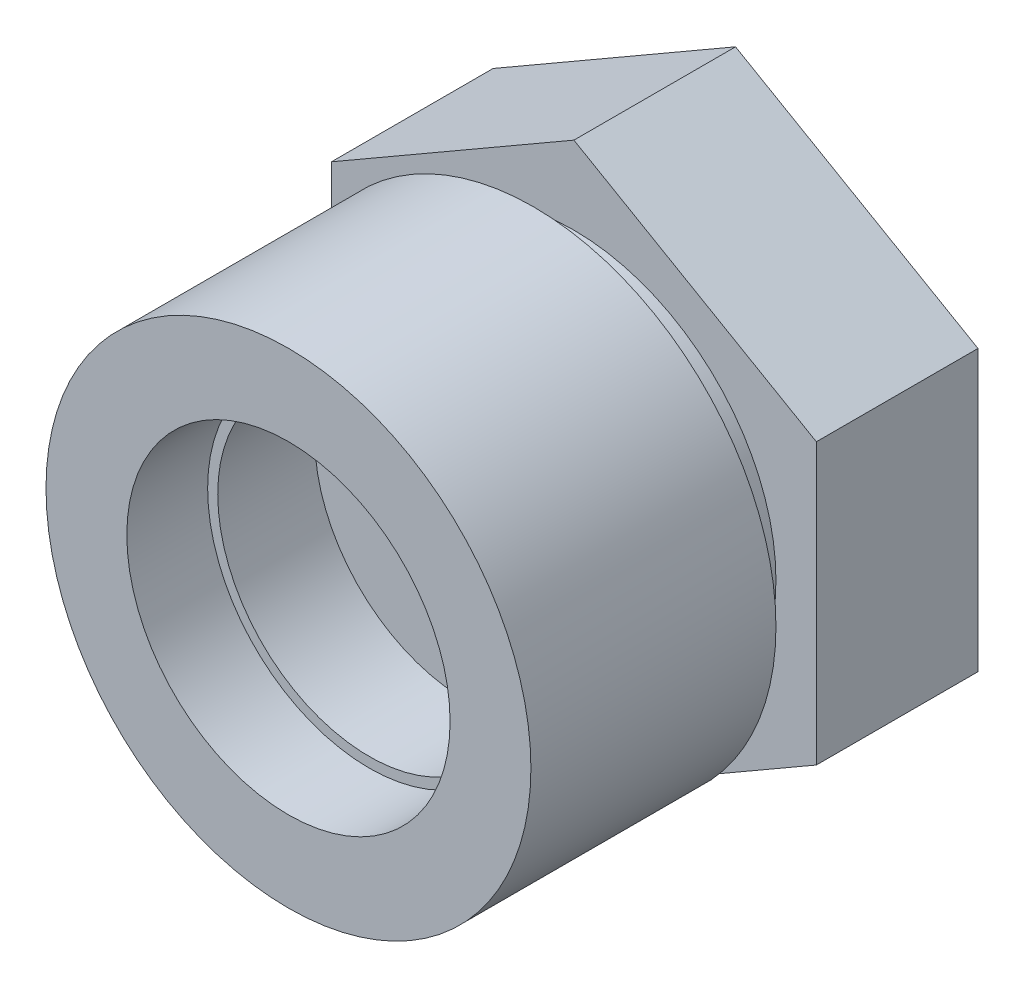
ISO-10303-21;
HEADER;
FILE_DESCRIPTION(('STEP AP214'),'2;1');
FILE_NAME('part.step','',(''),(''),'','','');
FILE_SCHEMA(('AUTOMOTIVE_DESIGN { 1 0 10303 214 1 1 1 1 }'));
ENDSEC;
DATA;
#1=APPLICATION_CONTEXT('core data for automotive mechanical design processes');
#2=APPLICATION_PROTOCOL_DEFINITION('international standard','automotive_design',2000,#1);
#3=PRODUCT_CONTEXT('',#1,'mechanical');
#4=PRODUCT('Part','Part','',(#3));
#5=PRODUCT_RELATED_PRODUCT_CATEGORY('part','',(#4));
#6=PRODUCT_DEFINITION_FORMATION('','',#4);
#7=PRODUCT_DEFINITION_CONTEXT('part definition',#1,'design');
#8=PRODUCT_DEFINITION('design','',#6,#7);
#9=PRODUCT_DEFINITION_SHAPE('','',#8);
#10=(LENGTH_UNIT() NAMED_UNIT(*) SI_UNIT(.MILLI.,.METRE.));
#11=(NAMED_UNIT(*) PLANE_ANGLE_UNIT() SI_UNIT($,.RADIAN.));
#12=(NAMED_UNIT(*) SI_UNIT($,.STERADIAN.) SOLID_ANGLE_UNIT());
#13=UNCERTAINTY_MEASURE_WITH_UNIT(LENGTH_MEASURE(1.E-05),#10,'distance_accuracy_value','');
#14=(GEOMETRIC_REPRESENTATION_CONTEXT(3) GLOBAL_UNCERTAINTY_ASSIGNED_CONTEXT((#13)) GLOBAL_UNIT_ASSIGNED_CONTEXT((#10,
#11,#12)) REPRESENTATION_CONTEXT('',''));
#15=CARTESIAN_POINT('',(0.,0.,0.));
#16=DIRECTION('',(0.,0.,1.));
#17=DIRECTION('',(1.,0.,0.));
#18=AXIS2_PLACEMENT_3D('',#15,#16,#17);
#19=CARTESIAN_POINT('',(0.,0.,-6.35));
#20=DIRECTION('',(0.,0.,-1.));
#21=DIRECTION('',(-1.,0.,0.));
#22=AXIS2_PLACEMENT_3D('',#19,#20,#21);
#23=CYLINDRICAL_SURFACE('',#22,2.5527);
#24=CARTESIAN_POINT('',(0.,0.,1.5875));
#25=DIRECTION('',(0.,0.,1.));
#26=DIRECTION('',(1.,0.,0.));
#27=AXIS2_PLACEMENT_3D('',#24,#25,#26);
#28=CIRCLE('',#27,2.5527);
#29=CARTESIAN_POINT('',(2.5527,0.,1.5875));
#30=VERTEX_POINT('',#29);
#31=EDGE_CURVE('E55',#30,#30,#28,.T.);
#32=ORIENTED_EDGE('',*,*,#31,.F.);
#33=EDGE_LOOP('',(#32));
#34=FACE_BOUND('',#33,.T.);
#35=CARTESIAN_POINT('',(0.,0.,4.2291));
#36=DIRECTION('',(0.,0.,1.));
#37=DIRECTION('',(1.,0.,0.));
#38=AXIS2_PLACEMENT_3D('',#35,#36,#37);
#39=CIRCLE('',#38,2.5527);
#40=CARTESIAN_POINT('',(2.5527,0.,4.2291));
#41=VERTEX_POINT('',#40);
#42=EDGE_CURVE('E46',#41,#41,#39,.F.);
#43=ORIENTED_EDGE('',*,*,#42,.F.);
#44=EDGE_LOOP('',(#43));
#45=FACE_BOUND('',#44,.T.);
#46=ADVANCED_FACE('F42',(#34,#45),#23,.F.);
#47=CARTESIAN_POINT('',(0.,0.,11.2141));
#48=DIRECTION('',(0.,0.,-1.));
#49=DIRECTION('',(-1.,0.,0.));
#50=AXIS2_PLACEMENT_3D('',#47,#48,#49);
#51=CYLINDRICAL_SURFACE('',#50,9.525);
#52=CARTESIAN_POINT('',(0.,0.,11.2141));
#53=DIRECTION('',(0.,0.,1.));
#54=DIRECTION('',(1.,0.,0.));
#55=AXIS2_PLACEMENT_3D('',#52,#53,#54);
#56=CIRCLE('',#55,9.525);
#57=CARTESIAN_POINT('',(9.525,0.,11.2141));
#58=VERTEX_POINT('',#57);
#59=EDGE_CURVE('E11',#58,#58,#56,.T.);
#60=ORIENTED_EDGE('',*,*,#59,.F.);
#61=EDGE_LOOP('',(#60));
#62=FACE_BOUND('',#61,.T.);
#63=CARTESIAN_POINT('',(0.,0.,1.5875));
#64=DIRECTION('',(0.,0.,1.));
#65=DIRECTION('',(1.,0.,0.));
#66=AXIS2_PLACEMENT_3D('',#63,#64,#65);
#67=CIRCLE('',#66,9.525);
#68=CARTESIAN_POINT('',(9.525,0.,1.5875));
#69=VERTEX_POINT('',#68);
#70=EDGE_CURVE('E50',#69,#69,#67,.T.);
#71=ORIENTED_EDGE('',*,*,#70,.T.);
#72=EDGE_LOOP('',(#71));
#73=FACE_BOUND('',#72,.T.);
#74=ADVANCED_FACE('F44',(#62,#73),#51,.T.);
#75=CARTESIAN_POINT('',(0.,0.,11.2141));
#76=DIRECTION('',(0.,0.,1.));
#77=DIRECTION('',(1.,0.,0.));
#78=AXIS2_PLACEMENT_3D('',#75,#76,#77);
#79=PLANE('',#78);
#80=CARTESIAN_POINT('',(0.,0.,11.2141));
#81=DIRECTION('',(0.,0.,1.));
#82=DIRECTION('',(1.,0.,0.));
#83=AXIS2_PLACEMENT_3D('',#80,#81,#82);
#84=CIRCLE('',#83,6.35);
#85=CARTESIAN_POINT('',(6.35,0.,11.2141));
#86=VERTEX_POINT('',#85);
#87=EDGE_CURVE('E60',#86,#86,#84,.T.);
#88=ORIENTED_EDGE('',*,*,#87,.F.);
#89=EDGE_LOOP('',(#88));
#90=FACE_BOUND('',#89,.T.);
#91=ORIENTED_EDGE('',*,*,#59,.T.);
#92=EDGE_LOOP('',(#91));
#93=FACE_BOUND('',#92,.T.);
#94=ADVANCED_FACE('F83',(#90,#93),#79,.T.);
#95=CARTESIAN_POINT('',(0.,0.,1.5875));
#96=DIRECTION('',(0.,0.,1.));
#97=DIRECTION('',(1.,0.,0.));
#98=AXIS2_PLACEMENT_3D('',#95,#96,#97);
#99=PLANE('',#98);
#100=ORIENTED_EDGE('',*,*,#31,.T.);
#101=EDGE_LOOP('',(#100));
#102=FACE_BOUND('',#101,.T.);
#103=ORIENTED_EDGE('',*,*,#70,.F.);
#104=EDGE_LOOP('',(#103));
#105=FACE_BOUND('',#104,.T.);
#106=ADVANCED_FACE('F91',(#102,#105),#99,.F.);
#107=CARTESIAN_POINT('',(0.,0.,8.0391));
#108=DIRECTION('',(0.,0.,1.));
#109=DIRECTION('',(1.,0.,0.));
#110=AXIS2_PLACEMENT_3D('',#107,#108,#109);
#111=PLANE('',#110);
#112=CARTESIAN_POINT('',(0.,0.,8.0391));
#113=DIRECTION('',(0.,0.,1.));
#114=DIRECTION('',(1.,0.,0.));
#115=AXIS2_PLACEMENT_3D('',#112,#113,#114);
#116=CIRCLE('',#115,5.953125);
#117=CARTESIAN_POINT('',(5.953125,0.,8.0391));
#118=VERTEX_POINT('',#117);
#119=EDGE_CURVE('E65',#118,#118,#116,.T.);
#120=ORIENTED_EDGE('',*,*,#119,.F.);
#121=EDGE_LOOP('',(#120));
#122=FACE_BOUND('',#121,.T.);
#123=CARTESIAN_POINT('',(0.,0.,8.0391));
#124=DIRECTION('',(0.,0.,1.));
#125=DIRECTION('',(1.,0.,0.));
#126=AXIS2_PLACEMENT_3D('',#123,#124,#125);
#127=CIRCLE('',#126,6.35);
#128=CARTESIAN_POINT('',(6.35,0.,8.0391));
#129=VERTEX_POINT('',#128);
#130=EDGE_CURVE('E59',#129,#129,#127,.T.);
#131=ORIENTED_EDGE('',*,*,#130,.T.);
#132=EDGE_LOOP('',(#131));
#133=FACE_BOUND('',#132,.T.);
#134=ADVANCED_FACE('F94',(#122,#133),#111,.T.);
#135=CARTESIAN_POINT('',(0.,0.,8.0391));
#136=DIRECTION('',(0.,0.,1.));
#137=DIRECTION('',(1.,0.,0.));
#138=AXIS2_PLACEMENT_3D('',#135,#136,#137);
#139=CYLINDRICAL_SURFACE('',#138,6.35);
#140=ORIENTED_EDGE('',*,*,#130,.F.);
#141=EDGE_LOOP('',(#140));
#142=FACE_BOUND('',#141,.T.);
#143=ORIENTED_EDGE('',*,*,#87,.T.);
#144=EDGE_LOOP('',(#143));
#145=FACE_BOUND('',#144,.T.);
#146=ADVANCED_FACE('F88',(#142,#145),#139,.F.);
#147=CARTESIAN_POINT('',(0.,0.,4.2291));
#148=DIRECTION('',(0.,0.,1.));
#149=DIRECTION('',(1.,0.,0.));
#150=AXIS2_PLACEMENT_3D('',#147,#148,#149);
#151=PLANE('',#150);
#152=CARTESIAN_POINT('',(0.,0.,4.2291));
#153=DIRECTION('',(0.,0.,1.));
#154=DIRECTION('',(1.,0.,0.));
#155=AXIS2_PLACEMENT_3D('',#152,#153,#154);
#156=CIRCLE('',#155,5.953125);
#157=CARTESIAN_POINT('',(5.953125,0.,4.2291));
#158=VERTEX_POINT('',#157);
#159=EDGE_CURVE('E68',#158,#158,#156,.T.);
#160=ORIENTED_EDGE('',*,*,#159,.T.);
#161=EDGE_LOOP('',(#160));
#162=FACE_BOUND('',#161,.T.);
#163=ORIENTED_EDGE('',*,*,#42,.T.);
#164=EDGE_LOOP('',(#163));
#165=FACE_BOUND('',#164,.T.);
#166=ADVANCED_FACE('F75',(#162,#165),#151,.T.);
#167=CARTESIAN_POINT('',(0.,0.,4.2291));
#168=DIRECTION('',(0.,0.,1.));
#169=DIRECTION('',(1.,0.,0.));
#170=AXIS2_PLACEMENT_3D('',#167,#168,#169);
#171=CYLINDRICAL_SURFACE('',#170,5.953125);
#172=CARTESIAN_POINT('',(5.953125,0.,4.2291));
#173=CARTESIAN_POINT('',(5.953125,0.,4.2687875));
#174=CARTESIAN_POINT('',(5.953125,0.,4.308475));
#175=CARTESIAN_POINT('',(5.953125,0.,4.38785));
#176=CARTESIAN_POINT('',(5.953125,0.,4.4275375));
#177=CARTESIAN_POINT('',(5.953125,0.,4.5069125));
#178=CARTESIAN_POINT('',(5.953125,0.,4.5466));
#179=CARTESIAN_POINT('',(5.953125,0.,4.625975));
#180=CARTESIAN_POINT('',(5.953125,0.,4.6656625));
#181=CARTESIAN_POINT('',(5.953125,0.,4.7450375));
#182=CARTESIAN_POINT('',(5.953125,0.,4.784725));
#183=CARTESIAN_POINT('',(5.953125,0.,4.8641));
#184=CARTESIAN_POINT('',(5.953125,0.,4.9037875));
#185=CARTESIAN_POINT('',(5.953125,0.,4.9831625));
#186=CARTESIAN_POINT('',(5.953125,0.,5.02285));
#187=CARTESIAN_POINT('',(5.953125,0.,5.102225));
#188=CARTESIAN_POINT('',(5.953125,0.,5.1419125));
#189=CARTESIAN_POINT('',(5.953125,0.,5.2212875));
#190=CARTESIAN_POINT('',(5.953125,0.,5.260975));
#191=CARTESIAN_POINT('',(5.953125,0.,5.34035));
#192=CARTESIAN_POINT('',(5.953125,0.,5.3800375));
#193=CARTESIAN_POINT('',(5.953125,0.,5.4594125));
#194=CARTESIAN_POINT('',(5.953125,0.,5.4991));
#195=CARTESIAN_POINT('',(5.953125,0.,5.578475));
#196=CARTESIAN_POINT('',(5.953125,0.,5.6181625));
#197=CARTESIAN_POINT('',(5.953125,0.,5.6975375));
#198=CARTESIAN_POINT('',(5.953125,0.,5.737225));
#199=CARTESIAN_POINT('',(5.953125,0.,5.8166));
#200=CARTESIAN_POINT('',(5.953125,0.,5.8562875));
#201=CARTESIAN_POINT('',(5.953125,0.,5.9356625));
#202=CARTESIAN_POINT('',(5.953125,0.,5.97535));
#203=CARTESIAN_POINT('',(5.953125,0.,6.054725));
#204=CARTESIAN_POINT('',(5.953125,0.,6.0944125));
#205=CARTESIAN_POINT('',(5.953125,0.,6.1737875));
#206=CARTESIAN_POINT('',(5.953125,0.,6.213475));
#207=CARTESIAN_POINT('',(5.953125,0.,6.29285));
#208=CARTESIAN_POINT('',(5.953125,0.,6.3325375));
#209=CARTESIAN_POINT('',(5.953125,0.,6.4119125));
#210=CARTESIAN_POINT('',(5.953125,0.,6.4516));
#211=CARTESIAN_POINT('',(5.953125,0.,6.530975));
#212=CARTESIAN_POINT('',(5.953125,0.,6.5706625));
#213=CARTESIAN_POINT('',(5.953125,0.,6.6500375));
#214=CARTESIAN_POINT('',(5.953125,0.,6.689725));
#215=CARTESIAN_POINT('',(5.953125,0.,6.7691));
#216=CARTESIAN_POINT('',(5.953125,0.,6.8087875));
#217=CARTESIAN_POINT('',(5.953125,0.,6.8881625));
#218=CARTESIAN_POINT('',(5.953125,0.,6.92785));
#219=CARTESIAN_POINT('',(5.953125,0.,7.007225));
#220=CARTESIAN_POINT('',(5.953125,0.,7.0469125));
#221=CARTESIAN_POINT('',(5.953125,0.,7.1262875));
#222=CARTESIAN_POINT('',(5.953125,0.,7.165975));
#223=CARTESIAN_POINT('',(5.953125,0.,7.24535));
#224=CARTESIAN_POINT('',(5.953125,0.,7.2850375));
#225=CARTESIAN_POINT('',(5.953125,0.,7.3644125));
#226=CARTESIAN_POINT('',(5.953125,0.,7.4041));
#227=CARTESIAN_POINT('',(5.953125,0.,7.483475));
#228=CARTESIAN_POINT('',(5.953125,0.,7.5231625));
#229=CARTESIAN_POINT('',(5.953125,0.,7.6025375));
#230=CARTESIAN_POINT('',(5.953125,0.,7.642225));
#231=CARTESIAN_POINT('',(5.953125,0.,7.7216));
#232=CARTESIAN_POINT('',(5.953125,0.,7.7612875));
#233=CARTESIAN_POINT('',(5.953125,0.,7.8406625));
#234=CARTESIAN_POINT('',(5.953125,0.,7.88035));
#235=CARTESIAN_POINT('',(5.953125,0.,7.959725));
#236=CARTESIAN_POINT('',(5.953125,0.,7.9994125));
#237=CARTESIAN_POINT('',(5.953125,0.,8.0391));
#238=B_SPLINE_CURVE_WITH_KNOTS('',3,(#172,#173,#174,#175,#176,#177,#178,#179,#180,#181,#182,
#183,#184,#185,#186,#187,#188,#189,#190,#191,#192,#193,#194,#195,#196,#197,#198,#199,#200,#201,
#202,#203,#204,#205,#206,#207,#208,#209,#210,#211,#212,#213,#214,#215,#216,#217,#218,#219,#220,
#221,#222,#223,#224,#225,#226,#227,#228,#229,#230,#231,#232,#233,#234,#235,#236,#237),
.UNSPECIFIED.,.F.,.F.,(4,2,2,2,2,2,2,2,2,2,2,2,2,2,2,2,2,2,2,2,2,2,2,2,2,2,2,2,2,2,2,2,4),(0.,
0.119062499999999,0.238125,0.357187499999999,0.476249999999999,0.595312499999999,
0.714374999999999,0.833437499999999,0.952499999999999,1.0715625,1.190625,1.3096875,1.42875,
1.5478125,1.666875,1.7859375,1.905,2.0240625,2.143125,2.2621875,2.38125,2.5003125,2.619375,
2.7384375,2.8575,2.9765625,3.095625,3.2146875,3.33375,3.4528125,3.571875,3.6909375,3.81),.UNSPECIFIED.);
#239=EDGE_CURVE('BSEAM110',#158,#118,#238,.T.);
#240=ORIENTED_EDGE('',*,*,#159,.F.);
#241=ORIENTED_EDGE('',*,*,#119,.T.);
#242=ORIENTED_EDGE('',*,*,#239,.T.);
#243=ORIENTED_EDGE('',*,*,#239,.F.);
#244=EDGE_LOOP('',(#240,#242,#241,#243));
#245=FACE_BOUND('',#244,.T.);
#246=ADVANCED_FACE('F110',(#245),#171,.F.);
#247=CLOSED_SHELL('',(#46,#74,#94,#106,#134,#146,#166,#246));
#248=MANIFOLD_SOLID_BREP('B2',#247);
#249=CARTESIAN_POINT('',(0.,0.,1.5875));
#250=DIRECTION('',(0.,0.,-1.));
#251=DIRECTION('',(-1.,0.,0.));
#252=AXIS2_PLACEMENT_3D('',#249,#250,#251);
#253=CYLINDRICAL_SURFACE('',#252,7.9375);
#254=CARTESIAN_POINT('',(0.,0.,1.5875));
#255=DIRECTION('',(0.,0.,1.));
#256=DIRECTION('',(1.,0.,0.));
#257=AXIS2_PLACEMENT_3D('',#254,#255,#256);
#258=CIRCLE('',#257,7.9375);
#259=CARTESIAN_POINT('',(7.9375,0.,1.5875));
#260=VERTEX_POINT('',#259);
#261=EDGE_CURVE('E41',#260,#260,#258,.T.);
#262=ORIENTED_EDGE('',*,*,#261,.F.);
#263=EDGE_LOOP('',(#262));
#264=FACE_BOUND('',#263,.T.);
#265=CARTESIAN_POINT('',(0.,0.,0.));
#266=DIRECTION('',(0.,0.,1.));
#267=DIRECTION('',(1.,0.,0.));
#268=AXIS2_PLACEMENT_3D('',#265,#266,#267);
#269=CIRCLE('',#268,7.9375);
#270=CARTESIAN_POINT('',(7.9375,0.,0.));
#271=VERTEX_POINT('',#270);
#272=EDGE_CURVE('E184',#271,#271,#269,.T.);
#273=ORIENTED_EDGE('',*,*,#272,.T.);
#274=EDGE_LOOP('',(#273));
#275=FACE_BOUND('',#274,.T.);
#276=ADVANCED_FACE('F177',(#264,#275),#253,.T.);
#277=CARTESIAN_POINT('',(0.,0.,1.5875));
#278=DIRECTION('',(0.,0.,1.));
#279=DIRECTION('',(1.,0.,0.));
#280=AXIS2_PLACEMENT_3D('',#277,#278,#279);
#281=PLANE('',#280);
#282=CARTESIAN_POINT('',(0.,0.,1.5875));
#283=DIRECTION('',(0.,0.,1.));
#284=DIRECTION('',(1.,0.,0.));
#285=AXIS2_PLACEMENT_3D('',#282,#283,#284);
#286=CIRCLE('',#285,2.5527);
#287=CARTESIAN_POINT('',(2.5527,0.,1.5875));
#288=VERTEX_POINT('',#287);
#289=EDGE_CURVE('E189',#288,#288,#286,.T.);
#290=ORIENTED_EDGE('',*,*,#289,.F.);
#291=EDGE_LOOP('',(#290));
#292=FACE_BOUND('',#291,.T.);
#293=ORIENTED_EDGE('',*,*,#261,.T.);
#294=EDGE_LOOP('',(#293));
#295=FACE_BOUND('',#294,.T.);
#296=ADVANCED_FACE('F206',(#292,#295),#281,.T.);
#297=CARTESIAN_POINT('',(0.,0.,0.));
#298=DIRECTION('',(0.,0.,1.));
#299=DIRECTION('',(1.,0.,0.));
#300=AXIS2_PLACEMENT_3D('',#297,#298,#299);
#301=PLANE('',#300);
#302=CARTESIAN_POINT('',(0.,0.,0.));
#303=DIRECTION('',(0.,0.,1.));
#304=DIRECTION('',(1.,0.,0.));
#305=AXIS2_PLACEMENT_3D('',#302,#303,#304);
#306=CIRCLE('',#305,2.5527);
#307=CARTESIAN_POINT('',(2.5527,0.,0.));
#308=VERTEX_POINT('',#307);
#309=EDGE_CURVE('E180',#308,#308,#306,.T.);
#310=ORIENTED_EDGE('',*,*,#309,.T.);
#311=EDGE_LOOP('',(#310));
#312=FACE_BOUND('',#311,.T.);
#313=ORIENTED_EDGE('',*,*,#272,.F.);
#314=EDGE_LOOP('',(#313));
#315=FACE_BOUND('',#314,.T.);
#316=ADVANCED_FACE('F197',(#312,#315),#301,.F.);
#317=CARTESIAN_POINT('',(0.,0.,-6.35));
#318=DIRECTION('',(0.,0.,-1.));
#319=DIRECTION('',(-1.,0.,0.));
#320=AXIS2_PLACEMENT_3D('',#317,#318,#319);
#321=CYLINDRICAL_SURFACE('',#320,2.5527);
#322=ORIENTED_EDGE('',*,*,#289,.T.);
#323=EDGE_LOOP('',(#322));
#324=FACE_BOUND('',#323,.T.);
#325=ORIENTED_EDGE('',*,*,#309,.F.);
#326=EDGE_LOOP('',(#325));
#327=FACE_BOUND('',#326,.T.);
#328=ADVANCED_FACE('F200',(#324,#327),#321,.F.);
#329=CLOSED_SHELL('',(#276,#296,#316,#328));
#330=MANIFOLD_SOLID_BREP('B6',#329);
#331=CARTESIAN_POINT('',(-9.52499999999994,-5.4992613140313,-6.35));
#332=DIRECTION('',(-0.499999999999995,-0.866025403784441,0.));
#333=DIRECTION('',(0.866025403784442,-0.499999999999995,0.));
#334=AXIS2_PLACEMENT_3D('',#331,#332,#333);
#335=PLANE('',#334);
#336=DIRECTION('',(0.866025403784441,-0.499999999999995,0.));
#337=VECTOR('',#336,1.);
#338=CARTESIAN_POINT('',(-9.52499999999994,-5.4992613140313,0.));
#339=LINE('',#338,#337);
#340=CARTESIAN_POINT('',(-9.52499999999994,-5.4992613140313,0.));
#341=VERTEX_POINT('',#340);
#342=CARTESIAN_POINT('',(0.,-10.9985226280624,0.));
#343=VERTEX_POINT('',#342);
#344=EDGE_CURVE('E328',#341,#343,#339,.T.);
#345=ORIENTED_EDGE('',*,*,#344,.F.);
#346=DIRECTION('',(0.,0.,1.));
#347=VECTOR('',#346,1.);
#348=CARTESIAN_POINT('',(-9.52499999999994,-5.4992613140313,-6.35));
#349=LINE('',#348,#347);
#350=CARTESIAN_POINT('',(-9.52499999999994,-5.4992613140313,-6.35));
#351=VERTEX_POINT('',#350);
#352=EDGE_CURVE('E175',#351,#341,#349,.T.);
#353=ORIENTED_EDGE('',*,*,#352,.F.);
#354=DIRECTION('',(0.866025403784441,-0.499999999999995,0.));
#355=VECTOR('',#354,1.);
#356=CARTESIAN_POINT('',(-9.52499999999994,-5.4992613140313,-6.35));
#357=LINE('',#356,#355);
#358=CARTESIAN_POINT('',(0.,-10.9985226280624,-6.35));
#359=VERTEX_POINT('',#358);
#360=EDGE_CURVE('E343',#351,#359,#357,.T.);
#361=ORIENTED_EDGE('',*,*,#360,.T.);
#362=DIRECTION('',(0.,0.,1.));
#363=VECTOR('',#362,1.);
#364=CARTESIAN_POINT('',(0.,-10.9985226280624,-6.35));
#365=LINE('',#364,#363);
#366=EDGE_CURVE('E246',#359,#343,#365,.T.);
#367=ORIENTED_EDGE('',*,*,#366,.T.);
#368=EDGE_LOOP('',(#345,#353,#361,#367));
#369=FACE_BOUND('',#368,.T.);
#370=ADVANCED_FACE('F243',(#369),#335,.T.);
#371=CARTESIAN_POINT('',(-9.52500000000006,5.4992613140311,-6.35));
#372=DIRECTION('',(-1.,0.,0.));
#373=DIRECTION('',(0.,-1.,0.));
#374=AXIS2_PLACEMENT_3D('',#371,#372,#373);
#375=PLANE('',#374);
#376=DIRECTION('',(0.,-1.,0.));
#377=VECTOR('',#376,1.);
#378=CARTESIAN_POINT('',(-9.52500000000006,5.4992613140311,0.));
#379=LINE('',#378,#377);
#380=CARTESIAN_POINT('',(-9.52500000000006,5.4992613140311,0.));
#381=VERTEX_POINT('',#380);
#382=EDGE_CURVE('E341',#381,#341,#379,.T.);
#383=ORIENTED_EDGE('',*,*,#382,.F.);
#384=DIRECTION('',(0.,0.,1.));
#385=VECTOR('',#384,1.);
#386=CARTESIAN_POINT('',(-9.52500000000006,5.4992613140311,-6.35));
#387=LINE('',#386,#385);
#388=CARTESIAN_POINT('',(-9.52500000000006,5.4992613140311,-6.35));
#389=VERTEX_POINT('',#388);
#390=EDGE_CURVE('E252',#389,#381,#387,.T.);
#391=ORIENTED_EDGE('',*,*,#390,.F.);
#392=DIRECTION('',(0.,-1.,0.));
#393=VECTOR('',#392,1.);
#394=CARTESIAN_POINT('',(-9.52500000000006,5.4992613140311,-6.35));
#395=LINE('',#394,#393);
#396=EDGE_CURVE('E318',#389,#351,#395,.T.);
#397=ORIENTED_EDGE('',*,*,#396,.T.);
#398=ORIENTED_EDGE('',*,*,#352,.T.);
#399=EDGE_LOOP('',(#383,#391,#397,#398));
#400=FACE_BOUND('',#399,.T.);
#401=ADVANCED_FACE('F351',(#400),#375,.T.);
#402=CARTESIAN_POINT('',(0.,10.9985226280624,-6.35));
#403=DIRECTION('',(-0.500000000000007,0.866025403784435,0.));
#404=DIRECTION('',(-0.866025403784435,-0.500000000000007,0.));
#405=AXIS2_PLACEMENT_3D('',#402,#403,#404);
#406=PLANE('',#405);
#407=DIRECTION('',(-0.866025403784435,-0.500000000000007,0.));
#408=VECTOR('',#407,1.);
#409=CARTESIAN_POINT('',(0.,10.9985226280624,0.));
#410=LINE('',#409,#408);
#411=CARTESIAN_POINT('',(0.,10.9985226280624,0.));
#412=VERTEX_POINT('',#411);
#413=EDGE_CURVE('E305',#412,#381,#410,.T.);
#414=ORIENTED_EDGE('',*,*,#413,.F.);
#415=DIRECTION('',(0.,0.,1.));
#416=VECTOR('',#415,1.);
#417=CARTESIAN_POINT('',(0.,10.9985226280624,-6.35));
#418=LINE('',#417,#416);
#419=CARTESIAN_POINT('',(0.,10.9985226280624,-6.35));
#420=VERTEX_POINT('',#419);
#421=EDGE_CURVE('E300',#420,#412,#418,.T.);
#422=ORIENTED_EDGE('',*,*,#421,.F.);
#423=DIRECTION('',(-0.866025403784435,-0.500000000000007,0.));
#424=VECTOR('',#423,1.);
#425=CARTESIAN_POINT('',(0.,10.9985226280624,-6.35));
#426=LINE('',#425,#424);
#427=EDGE_CURVE('E303',#420,#389,#426,.T.);
#428=ORIENTED_EDGE('',*,*,#427,.T.);
#429=ORIENTED_EDGE('',*,*,#390,.T.);
#430=EDGE_LOOP('',(#414,#422,#428,#429));
#431=FACE_BOUND('',#430,.T.);
#432=ADVANCED_FACE('F302',(#431),#406,.T.);
#433=CARTESIAN_POINT('',(9.52499999999998,5.49926131403123,-6.35));
#434=DIRECTION('',(0.499999999999995,0.866025403784441,0.));
#435=DIRECTION('',(-0.866025403784441,0.499999999999995,0.));
#436=AXIS2_PLACEMENT_3D('',#433,#434,#435);
#437=PLANE('',#436);
#438=DIRECTION('',(-0.866025403784441,0.499999999999995,0.));
#439=VECTOR('',#438,1.);
#440=CARTESIAN_POINT('',(9.52499999999998,5.49926131403123,0.));
#441=LINE('',#440,#439);
#442=CARTESIAN_POINT('',(9.52499999999998,5.49926131403123,0.));
#443=VERTEX_POINT('',#442);
#444=EDGE_CURVE('E338',#443,#412,#441,.T.);
#445=ORIENTED_EDGE('',*,*,#444,.F.);
#446=DIRECTION('',(0.,0.,1.));
#447=VECTOR('',#446,1.);
#448=CARTESIAN_POINT('',(9.52499999999998,5.49926131403123,-6.35));
#449=LINE('',#448,#447);
#450=CARTESIAN_POINT('',(9.52499999999998,5.49926131403123,-6.35));
#451=VERTEX_POINT('',#450);
#452=EDGE_CURVE('E310',#451,#443,#449,.T.);
#453=ORIENTED_EDGE('',*,*,#452,.F.);
#454=DIRECTION('',(-0.866025403784441,0.499999999999995,0.));
#455=VECTOR('',#454,1.);
#456=CARTESIAN_POINT('',(9.52499999999998,5.49926131403123,-6.35));
#457=LINE('',#456,#455);
#458=EDGE_CURVE('E316',#451,#420,#457,.T.);
#459=ORIENTED_EDGE('',*,*,#458,.T.);
#460=ORIENTED_EDGE('',*,*,#421,.T.);
#461=EDGE_LOOP('',(#445,#453,#459,#460));
#462=FACE_BOUND('',#461,.T.);
#463=ADVANCED_FACE('F320',(#462),#437,.T.);
#464=CARTESIAN_POINT('',(9.52500000000002,-5.49926131403117,-6.35));
#465=DIRECTION('',(1.,0.,0.));
#466=DIRECTION('',(0.,1.,0.));
#467=AXIS2_PLACEMENT_3D('',#464,#465,#466);
#468=PLANE('',#467);
#469=DIRECTION('',(0.,1.,0.));
#470=VECTOR('',#469,1.);
#471=CARTESIAN_POINT('',(9.52500000000002,-5.49926131403117,0.));
#472=LINE('',#471,#470);
#473=CARTESIAN_POINT('',(9.52500000000002,-5.49926131403117,0.));
#474=VERTEX_POINT('',#473);
#475=EDGE_CURVE('E335',#474,#443,#472,.T.);
#476=ORIENTED_EDGE('',*,*,#475,.F.);
#477=DIRECTION('',(0.,0.,1.));
#478=VECTOR('',#477,1.);
#479=CARTESIAN_POINT('',(9.52500000000002,-5.49926131403117,-6.35));
#480=LINE('',#479,#478);
#481=CARTESIAN_POINT('',(9.52500000000002,-5.49926131403117,-6.35));
#482=VERTEX_POINT('',#481);
#483=EDGE_CURVE('E346',#482,#474,#480,.T.);
#484=ORIENTED_EDGE('',*,*,#483,.F.);
#485=DIRECTION('',(0.,1.,0.));
#486=VECTOR('',#485,1.);
#487=CARTESIAN_POINT('',(9.52500000000002,-5.49926131403117,-6.35));
#488=LINE('',#487,#486);
#489=EDGE_CURVE('E321',#482,#451,#488,.T.);
#490=ORIENTED_EDGE('',*,*,#489,.T.);
#491=ORIENTED_EDGE('',*,*,#452,.T.);
#492=EDGE_LOOP('',(#476,#484,#490,#491));
#493=FACE_BOUND('',#492,.T.);
#494=ADVANCED_FACE('F364',(#493),#468,.T.);
#495=CARTESIAN_POINT('',(0.,-10.9985226280624,-6.35));
#496=DIRECTION('',(0.500000000000001,-0.866025403784438,0.));
#497=DIRECTION('',(0.866025403784438,0.500000000000001,0.));
#498=AXIS2_PLACEMENT_3D('',#495,#496,#497);
#499=PLANE('',#498);
#500=DIRECTION('',(0.866025403784438,0.500000000000001,0.));
#501=VECTOR('',#500,1.);
#502=CARTESIAN_POINT('',(0.,-10.9985226280624,0.));
#503=LINE('',#502,#501);
#504=EDGE_CURVE('E331',#343,#474,#503,.T.);
#505=ORIENTED_EDGE('',*,*,#504,.F.);
#506=ORIENTED_EDGE('',*,*,#366,.F.);
#507=DIRECTION('',(0.866025403784438,0.500000000000001,0.));
#508=VECTOR('',#507,1.);
#509=CARTESIAN_POINT('',(0.,-10.9985226280624,-6.35));
#510=LINE('',#509,#508);
#511=EDGE_CURVE('E323',#359,#482,#510,.T.);
#512=ORIENTED_EDGE('',*,*,#511,.T.);
#513=ORIENTED_EDGE('',*,*,#483,.T.);
#514=EDGE_LOOP('',(#505,#506,#512,#513));
#515=FACE_BOUND('',#514,.T.);
#516=ADVANCED_FACE('F348',(#515),#499,.T.);
#517=CARTESIAN_POINT('',(0.,0.,-6.35));
#518=DIRECTION('',(0.,0.,1.));
#519=DIRECTION('',(1.,0.,0.));
#520=AXIS2_PLACEMENT_3D('',#517,#518,#519);
#521=PLANE('',#520);
#522=CARTESIAN_POINT('',(0.,0.,-6.35));
#523=DIRECTION('',(0.,0.,-1.));
#524=DIRECTION('',(-1.,0.,0.));
#525=AXIS2_PLACEMENT_3D('',#522,#523,#524);
#526=CIRCLE('',#525,2.5527);
#527=CARTESIAN_POINT('',(-2.5527,0.,-6.35));
#528=VERTEX_POINT('',#527);
#529=EDGE_CURVE('E387',#528,#528,#526,.T.);
#530=ORIENTED_EDGE('',*,*,#529,.F.);
#531=EDGE_LOOP('',(#530));
#532=FACE_BOUND('',#531,.T.);
#533=ORIENTED_EDGE('',*,*,#360,.F.);
#534=ORIENTED_EDGE('',*,*,#396,.F.);
#535=ORIENTED_EDGE('',*,*,#427,.F.);
#536=ORIENTED_EDGE('',*,*,#458,.F.);
#537=ORIENTED_EDGE('',*,*,#489,.F.);
#538=ORIENTED_EDGE('',*,*,#511,.F.);
#539=EDGE_LOOP('',(#533,#534,#535,#536,#537,#538));
#540=FACE_BOUND('',#539,.T.);
#541=ADVANCED_FACE('F314',(#532,#540),#521,.F.);
#542=CARTESIAN_POINT('',(0.,0.,0.));
#543=DIRECTION('',(0.,0.,1.));
#544=DIRECTION('',(1.,0.,0.));
#545=AXIS2_PLACEMENT_3D('',#542,#543,#544);
#546=PLANE('',#545);
#547=CARTESIAN_POINT('',(0.,0.,0.));
#548=DIRECTION('',(0.,0.,1.));
#549=DIRECTION('',(1.,0.,0.));
#550=AXIS2_PLACEMENT_3D('',#547,#548,#549);
#551=CIRCLE('',#550,2.5527);
#552=CARTESIAN_POINT('',(2.5527,0.,0.));
#553=VERTEX_POINT('',#552);
#554=EDGE_CURVE('E332',#553,#553,#551,.T.);
#555=ORIENTED_EDGE('',*,*,#554,.F.);
#556=EDGE_LOOP('',(#555));
#557=FACE_BOUND('',#556,.T.);
#558=ORIENTED_EDGE('',*,*,#344,.T.);
#559=ORIENTED_EDGE('',*,*,#504,.T.);
#560=ORIENTED_EDGE('',*,*,#475,.T.);
#561=ORIENTED_EDGE('',*,*,#444,.T.);
#562=ORIENTED_EDGE('',*,*,#413,.T.);
#563=ORIENTED_EDGE('',*,*,#382,.T.);
#564=EDGE_LOOP('',(#558,#559,#560,#561,#562,#563));
#565=FACE_BOUND('',#564,.T.);
#566=ADVANCED_FACE('F350',(#557,#565),#546,.T.);
#567=CARTESIAN_POINT('',(0.,0.,-6.35));
#568=DIRECTION('',(0.,0.,-1.));
#569=DIRECTION('',(-1.,0.,0.));
#570=AXIS2_PLACEMENT_3D('',#567,#568,#569);
#571=CYLINDRICAL_SURFACE('',#570,2.5527);
#572=ORIENTED_EDGE('',*,*,#554,.T.);
#573=EDGE_LOOP('',(#572));
#574=FACE_BOUND('',#573,.T.);
#575=ORIENTED_EDGE('',*,*,#529,.T.);
#576=EDGE_LOOP('',(#575));
#577=FACE_BOUND('',#576,.T.);
#578=ADVANCED_FACE('F375',(#574,#577),#571,.F.);
#579=CLOSED_SHELL('',(#370,#401,#432,#463,#494,#516,#541,#566,#578));
#580=MANIFOLD_SOLID_BREP('B36',#579);
#581=ADVANCED_BREP_SHAPE_REPRESENTATION('',(#18,#248,#330,#580),#14);
#582=SHAPE_DEFINITION_REPRESENTATION(#9,#581);
ENDSEC;
END-ISO-10303-21;
